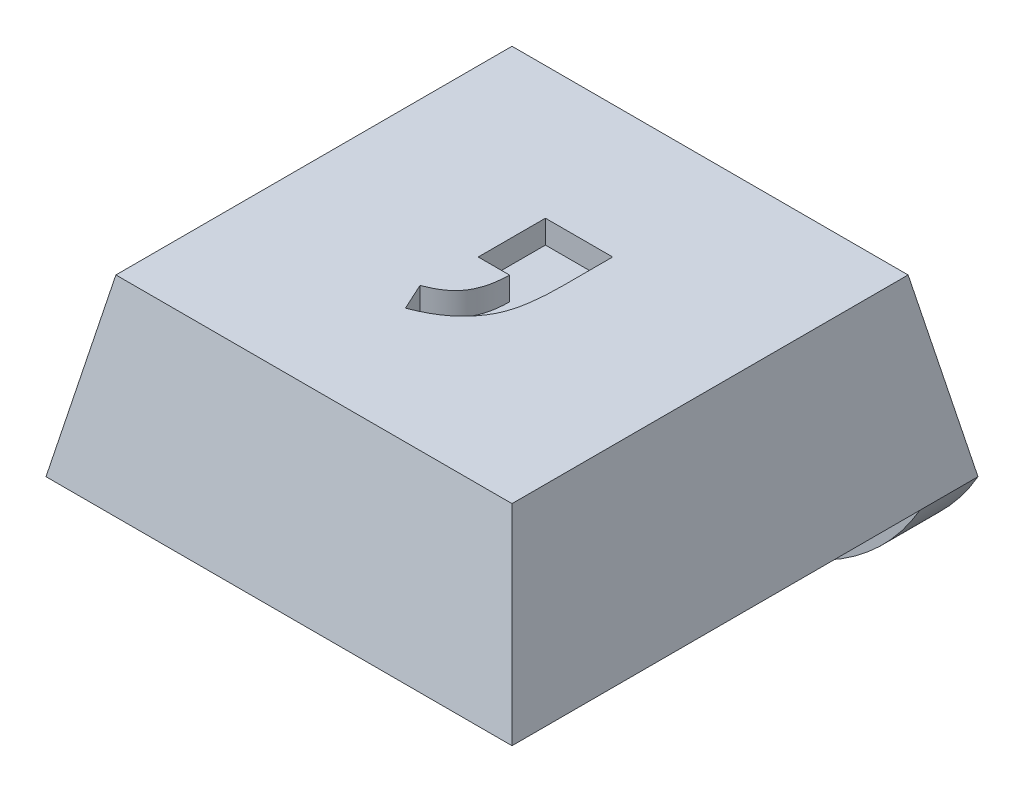
ISO-10303-21;
HEADER;
FILE_DESCRIPTION(('STEP AP214'),'2;1');
FILE_NAME('part.step','',(''),(''),'','','');
FILE_SCHEMA(('AUTOMOTIVE_DESIGN { 1 0 10303 214 1 1 1 1 }'));
ENDSEC;
DATA;
#1=APPLICATION_CONTEXT('core data for automotive mechanical design processes');
#2=APPLICATION_PROTOCOL_DEFINITION('international standard','automotive_design',2000,#1);
#3=PRODUCT_CONTEXT('',#1,'mechanical');
#4=PRODUCT('Part','Part','',(#3));
#5=PRODUCT_RELATED_PRODUCT_CATEGORY('part','',(#4));
#6=PRODUCT_DEFINITION_FORMATION('','',#4);
#7=PRODUCT_DEFINITION_CONTEXT('part definition',#1,'design');
#8=PRODUCT_DEFINITION('design','',#6,#7);
#9=PRODUCT_DEFINITION_SHAPE('','',#8);
#10=(LENGTH_UNIT() NAMED_UNIT(*) SI_UNIT(.MILLI.,.METRE.));
#11=(NAMED_UNIT(*) PLANE_ANGLE_UNIT() SI_UNIT($,.RADIAN.));
#12=(NAMED_UNIT(*) SI_UNIT($,.STERADIAN.) SOLID_ANGLE_UNIT());
#13=UNCERTAINTY_MEASURE_WITH_UNIT(LENGTH_MEASURE(1.E-05),#10,'distance_accuracy_value','');
#14=(GEOMETRIC_REPRESENTATION_CONTEXT(3) GLOBAL_UNCERTAINTY_ASSIGNED_CONTEXT((#13)) GLOBAL_UNIT_ASSIGNED_CONTEXT((#10,
#11,#12)) REPRESENTATION_CONTEXT('',''));
#15=CARTESIAN_POINT('',(0.,0.,0.));
#16=DIRECTION('',(0.,0.,1.));
#17=DIRECTION('',(1.,0.,0.));
#18=AXIS2_PLACEMENT_3D('',#15,#16,#17);
#19=CARTESIAN_POINT('',(0.,3.,0.));
#20=DIRECTION('',(0.,-1.,0.));
#21=DIRECTION('',(0.,0.,-1.));
#22=AXIS2_PLACEMENT_3D('',#19,#20,#21);
#23=PLANE('',#22);
#24=DIRECTION('',(-1.,0.,0.));
#25=VECTOR('',#24,1.);
#26=CARTESIAN_POINT('',(11.,3.,-0.6));
#27=LINE('',#26,#25);
#28=CARTESIAN_POINT('',(7.4,3.,-0.6));
#29=VERTEX_POINT('',#28);
#30=CARTESIAN_POINT('',(0.6,3.,-0.6));
#31=VERTEX_POINT('',#30);
#32=EDGE_CURVE('E200',#29,#31,#27,.T.);
#33=ORIENTED_EDGE('',*,*,#32,.F.);
#34=DIRECTION('',(0.,0.,1.));
#35=VECTOR('',#34,1.);
#36=CARTESIAN_POINT('',(7.4,3.,-8.));
#37=LINE('',#36,#35);
#38=CARTESIAN_POINT('',(7.4,3.,-7.4));
#39=VERTEX_POINT('',#38);
#40=EDGE_CURVE('E213',#39,#29,#37,.T.);
#41=ORIENTED_EDGE('',*,*,#40,.F.);
#42=DIRECTION('',(-1.,0.,0.));
#43=VECTOR('',#42,1.);
#44=CARTESIAN_POINT('',(11.,3.,-7.4));
#45=LINE('',#44,#43);
#46=CARTESIAN_POINT('',(0.599999999999999,3.,-7.4));
#47=VERTEX_POINT('',#46);
#48=EDGE_CURVE('E196',#39,#47,#45,.T.);
#49=ORIENTED_EDGE('',*,*,#48,.T.);
#50=DIRECTION('',(0.,0.,1.));
#51=VECTOR('',#50,1.);
#52=CARTESIAN_POINT('',(0.6,3.,-8.));
#53=LINE('',#52,#51);
#54=EDGE_CURVE('E216',#47,#31,#53,.T.);
#55=ORIENTED_EDGE('',*,*,#54,.T.);
#56=EDGE_LOOP('',(#33,#41,#49,#55));
#57=FACE_BOUND('',#56,.T.);
#58=DIRECTION('',(0.,0.,-1.));
#59=VECTOR('',#58,1.);
#60=CARTESIAN_POINT('',(3.44333189506148,3.,-3.97683988051996));
#61=LINE('',#60,#59);
#62=CARTESIAN_POINT('',(3.44333189506148,3.,-3.97683988051996));
#63=VERTEX_POINT('',#62);
#64=CARTESIAN_POINT('',(3.44333189506148,3.,-5.13068603436611));
#65=VERTEX_POINT('',#64);
#66=EDGE_CURVE('E59',#63,#65,#61,.T.);
#67=ORIENTED_EDGE('',*,*,#66,.T.);
#68=DIRECTION('',(1.,0.,0.));
#69=VECTOR('',#68,1.);
#70=CARTESIAN_POINT('',(3.44333189506148,3.,-5.13068603436611));
#71=LINE('',#70,#69);
#72=CARTESIAN_POINT('',(4.59717804890764,3.,-5.13068603436611));
#73=VERTEX_POINT('',#72);
#74=EDGE_CURVE('E168',#65,#73,#71,.T.);
#75=ORIENTED_EDGE('',*,*,#74,.T.);
#76=DIRECTION('',(0.,0.,1.));
#77=VECTOR('',#76,1.);
#78=CARTESIAN_POINT('',(4.59717804890764,3.,-5.13068603436611));
#79=LINE('',#78,#77);
#80=CARTESIAN_POINT('',(4.59717804890764,3.,-4.2917437266738));
#81=VERTEX_POINT('',#80);
#82=EDGE_CURVE('E569',#73,#81,#79,.T.);
#83=ORIENTED_EDGE('',*,*,#82,.T.);
#84=CARTESIAN_POINT('',(4.59717804890764,3.,-4.2917437266738));
#85=CARTESIAN_POINT('',(4.59664570205697,3.,-4.21117065502821));
#86=CARTESIAN_POINT('',(4.59564056136758,3.,-4.05903812587329));
#87=CARTESIAN_POINT('',(4.57802159676402,3.,-3.84443429493747));
#88=CARTESIAN_POINT('',(4.55354020663032,3.,-3.65597537157936));
#89=CARTESIAN_POINT('',(4.51459394977949,3.,-3.49123894257506));
#90=CARTESIAN_POINT('',(4.46244870361246,3.,-3.34246830222301));
#91=CARTESIAN_POINT('',(4.38872374214653,3.,-3.20633812547181));
#92=CARTESIAN_POINT('',(4.29805614703845,3.,-3.0760663071622));
#93=CARTESIAN_POINT('',(4.18715473139393,3.,-2.95559473776196));
#94=CARTESIAN_POINT('',(4.05957794146906,3.,-2.84417063430685));
#95=CARTESIAN_POINT('',(3.91384748090174,3.,-2.74727533534055));
#96=CARTESIAN_POINT('',(3.75342175566438,3.,-2.66094640759871));
#97=CARTESIAN_POINT('',(3.63816832671193,3.,-2.61549785110123));
#98=CARTESIAN_POINT('',(3.57914920275379,3.,-2.59222449590457));
#99=B_SPLINE_CURVE_WITH_KNOTS('',3,(#84,#85,#86,#87,#88,#89,#90,#91,#92,#93,#94,#95,#96,#97,
#98),.UNSPECIFIED.,.F.,.F.,(4,1,1,1,1,1,1,1,1,1,1,1,4),(0.,0.11226306929848,0.211967401940366,
0.29994169044828,0.376872974033872,0.447529216959618,0.518973247744178,0.591939579442453,
0.668229800220916,0.746606683184938,0.827453118097728,0.911641971053369,1.),.UNSPECIFIED.);
#100=CARTESIAN_POINT('',(3.57914920275379,3.,-2.59222449590457));
#101=VERTEX_POINT('',#100);
#102=EDGE_CURVE('E564',#81,#101,#99,.T.);
#103=ORIENTED_EDGE('',*,*,#102,.T.);
#104=DIRECTION('',(-0.418608195745654,0.,-0.908166933143114));
#105=VECTOR('',#104,1.);
#106=CARTESIAN_POINT('',(3.57914920275379,3.,-2.59222449590457));
#107=LINE('',#106,#105);
#108=CARTESIAN_POINT('',(3.36640881813841,3.,-3.05376295744303));
#109=VERTEX_POINT('',#108);
#110=EDGE_CURVE('E554',#101,#109,#107,.T.);
#111=ORIENTED_EDGE('',*,*,#110,.T.);
#112=CARTESIAN_POINT('',(3.36640881813841,3.,-3.05376295744303));
#113=CARTESIAN_POINT('',(3.41787487419886,3.,-3.0749283403816));
#114=CARTESIAN_POINT('',(3.51608049509068,3.,-3.11531533973616));
#115=CARTESIAN_POINT('',(3.64772184124044,3.,-3.19311523218575));
#116=CARTESIAN_POINT('',(3.75421652325334,3.,-3.28466671684255));
#117=CARTESIAN_POINT('',(3.83984154767036,3.,-3.38842301053576));
#118=CARTESIAN_POINT('',(3.9010592927936,3.,-3.51047208401217));
#119=CARTESIAN_POINT('',(3.94706557535518,3.,-3.64875286186587));
#120=CARTESIAN_POINT('',(3.97373457756071,3.,-3.80680253731697));
#121=CARTESIAN_POINT('',(3.97901655312841,3.,-3.91824926084624));
#122=CARTESIAN_POINT('',(3.98179343352302,3.,-3.97683988051996));
#123=B_SPLINE_CURVE_WITH_KNOTS('',3,(#112,#113,#114,#115,#116,#117,#118,#119,#120,#121,#122),
.UNSPECIFIED.,.F.,.F.,(4,1,1,1,1,1,1,1,4),(0.,0.139244977144443,0.26570210510156,
0.380936804013601,0.489358564032474,0.600190245832484,0.720743413981993,0.853187102279749,1.),.UNSPECIFIED.);
#124=CARTESIAN_POINT('',(3.98179343352302,3.,-3.97683988051996));
#125=VERTEX_POINT('',#124);
#126=EDGE_CURVE('E563',#109,#125,#123,.T.);
#127=ORIENTED_EDGE('',*,*,#126,.T.);
#128=DIRECTION('',(-1.,0.,0.));
#129=VECTOR('',#128,1.);
#130=CARTESIAN_POINT('',(3.98179343352302,3.,-3.97683988051996));
#131=LINE('',#130,#129);
#132=EDGE_CURVE('E164',#125,#63,#131,.T.);
#133=ORIENTED_EDGE('',*,*,#132,.T.);
#134=EDGE_LOOP('',(#67,#75,#83,#103,#111,#127,#133));
#135=FACE_BOUND('',#134,.T.);
#136=ADVANCED_FACE('F43',(#57,#135),#23,.F.);
#137=CARTESIAN_POINT('',(8.,0.,-8.));
#138=DIRECTION('',(-0.98058067569092,-0.196116135138184,0.));
#139=DIRECTION('',(0.196116135138184,-0.98058067569092,0.));
#140=AXIS2_PLACEMENT_3D('',#137,#138,#139);
#141=PLANE('',#140);
#142=DIRECTION('',(-0.192450089729875,0.962250448649376,-0.192450089729875));
#143=VECTOR('',#142,1.);
#144=CARTESIAN_POINT('',(7.7037037037037,1.48148148148148,-0.296296296296296));
#145=LINE('',#144,#143);
#146=CARTESIAN_POINT('',(8.,0.,0.));
#147=VERTEX_POINT('',#146);
#148=EDGE_CURVE('E210',#147,#29,#145,.T.);
#149=ORIENTED_EDGE('',*,*,#148,.F.);
#150=DIRECTION('',(0.,0.,-1.));
#151=VECTOR('',#150,1.);
#152=CARTESIAN_POINT('',(8.,0.,0.));
#153=LINE('',#152,#151);
#154=CARTESIAN_POINT('',(8.,0.,-7.));
#155=VERTEX_POINT('',#154);
#156=EDGE_CURVE('E229',#147,#155,#153,.T.);
#157=ORIENTED_EDGE('',*,*,#156,.T.);
#158=DIRECTION('',(0.,0.,1.));
#159=VECTOR('',#158,1.);
#160=CARTESIAN_POINT('',(8.,0.,-8.));
#161=LINE('',#160,#159);
#162=CARTESIAN_POINT('',(8.,0.,-8.));
#163=VERTEX_POINT('',#162);
#164=EDGE_CURVE('E170',#163,#155,#161,.T.);
#165=ORIENTED_EDGE('',*,*,#164,.F.);
#166=DIRECTION('',(0.192450089729875,-0.962250448649376,-0.192450089729875));
#167=VECTOR('',#166,1.);
#168=CARTESIAN_POINT('',(8.,0.,-8.));
#169=LINE('',#168,#167);
#170=EDGE_CURVE('E203',#39,#163,#169,.T.);
#171=ORIENTED_EDGE('',*,*,#170,.F.);
#172=ORIENTED_EDGE('',*,*,#40,.T.);
#173=EDGE_LOOP('',(#149,#157,#165,#171,#172));
#174=FACE_BOUND('',#173,.T.);
#175=ADVANCED_FACE('F297',(#174),#141,.F.);
#176=CARTESIAN_POINT('',(0.,0.,-8.));
#177=DIRECTION('',(0.98058067569092,-0.196116135138184,0.));
#178=DIRECTION('',(0.196116135138184,0.98058067569092,0.));
#179=AXIS2_PLACEMENT_3D('',#176,#177,#178);
#180=PLANE('',#179);
#181=DIRECTION('',(-0.192450089729875,-0.962250448649376,0.192450089729875));
#182=VECTOR('',#181,1.);
#183=CARTESIAN_POINT('',(0.296296296296296,1.48148148148148,-0.296296296296296));
#184=LINE('',#183,#182);
#185=CARTESIAN_POINT('',(0.,0.,0.));
#186=VERTEX_POINT('',#185);
#187=EDGE_CURVE('E257',#31,#186,#184,.T.);
#188=ORIENTED_EDGE('',*,*,#187,.F.);
#189=ORIENTED_EDGE('',*,*,#54,.F.);
#190=DIRECTION('',(0.192450089729875,0.962250448649376,0.192450089729875));
#191=VECTOR('',#190,1.);
#192=CARTESIAN_POINT('',(0.,0.,-8.));
#193=LINE('',#192,#191);
#194=CARTESIAN_POINT('',(0.,0.,-8.));
#195=VERTEX_POINT('',#194);
#196=EDGE_CURVE('E228',#195,#47,#193,.T.);
#197=ORIENTED_EDGE('',*,*,#196,.F.);
#198=DIRECTION('',(0.,0.,1.));
#199=VECTOR('',#198,1.);
#200=CARTESIAN_POINT('',(0.,0.,0.));
#201=LINE('',#200,#199);
#202=CARTESIAN_POINT('',(0.,0.,-7.));
#203=VERTEX_POINT('',#202);
#204=EDGE_CURVE('E233',#195,#203,#201,.T.);
#205=ORIENTED_EDGE('',*,*,#204,.T.);
#206=EDGE_CURVE('E220',#203,#186,#201,.T.);
#207=ORIENTED_EDGE('',*,*,#206,.T.);
#208=EDGE_LOOP('',(#188,#189,#197,#205,#207));
#209=FACE_BOUND('',#208,.T.);
#210=ADVANCED_FACE('F281',(#209),#180,.F.);
#211=CARTESIAN_POINT('',(0.,0.,0.));
#212=DIRECTION('',(0.,-1.,0.));
#213=DIRECTION('',(0.,0.,-1.));
#214=AXIS2_PLACEMENT_3D('',#211,#212,#213);
#215=PLANE('',#214);
#216=DIRECTION('',(-1.,0.,0.));
#217=VECTOR('',#216,1.);
#218=CARTESIAN_POINT('',(0.,0.,-7.));
#219=LINE('',#218,#217);
#220=EDGE_CURVE('E176',#155,#203,#219,.T.);
#221=ORIENTED_EDGE('',*,*,#220,.F.);
#222=ORIENTED_EDGE('',*,*,#156,.F.);
#223=DIRECTION('',(1.,0.,0.));
#224=VECTOR('',#223,1.);
#225=CARTESIAN_POINT('',(0.,0.,0.));
#226=LINE('',#225,#224);
#227=EDGE_CURVE('E230',#186,#147,#226,.T.);
#228=ORIENTED_EDGE('',*,*,#227,.F.);
#229=ORIENTED_EDGE('',*,*,#206,.F.);
#230=EDGE_LOOP('',(#221,#222,#228,#229));
#231=FACE_BOUND('',#230,.T.);
#232=CARTESIAN_POINT('',(4.,0.,-3.75));
#233=DIRECTION('',(0.,-1.,0.));
#234=DIRECTION('',(0.,0.,-1.));
#235=AXIS2_PLACEMENT_3D('',#232,#233,#234);
#236=CIRCLE('',#235,1.75);
#237=CARTESIAN_POINT('',(4.,0.,-5.5));
#238=VERTEX_POINT('',#237);
#239=EDGE_CURVE('E188',#238,#238,#236,.T.);
#240=ORIENTED_EDGE('',*,*,#239,.F.);
#241=EDGE_LOOP('',(#240));
#242=FACE_BOUND('',#241,.T.);
#243=ADVANCED_FACE('F292',(#231,#242),#215,.T.);
#244=CARTESIAN_POINT('',(11.,3.,-7.4));
#245=DIRECTION('',(0.,0.196116135138184,-0.98058067569092));
#246=DIRECTION('',(0.,0.98058067569092,0.196116135138184));
#247=AXIS2_PLACEMENT_3D('',#244,#245,#246);
#248=PLANE('',#247);
#249=ORIENTED_EDGE('',*,*,#170,.T.);
#250=DIRECTION('',(-1.,0.,0.));
#251=VECTOR('',#250,1.);
#252=CARTESIAN_POINT('',(0.,0.,-8.));
#253=LINE('',#252,#251);
#254=EDGE_CURVE('E224',#163,#195,#253,.T.);
#255=ORIENTED_EDGE('',*,*,#254,.T.);
#256=ORIENTED_EDGE('',*,*,#196,.T.);
#257=ORIENTED_EDGE('',*,*,#48,.F.);
#258=EDGE_LOOP('',(#249,#255,#256,#257));
#259=FACE_BOUND('',#258,.T.);
#260=ADVANCED_FACE('F276',(#259),#248,.T.);
#261=CARTESIAN_POINT('',(11.,0.,0.));
#262=DIRECTION('',(0.,0.196116135138184,0.98058067569092));
#263=DIRECTION('',(0.,-0.98058067569092,0.196116135138184));
#264=AXIS2_PLACEMENT_3D('',#261,#262,#263);
#265=PLANE('',#264);
#266=ORIENTED_EDGE('',*,*,#148,.T.);
#267=ORIENTED_EDGE('',*,*,#32,.T.);
#268=ORIENTED_EDGE('',*,*,#187,.T.);
#269=ORIENTED_EDGE('',*,*,#227,.T.);
#270=EDGE_LOOP('',(#266,#267,#268,#269));
#271=FACE_BOUND('',#270,.T.);
#272=ADVANCED_FACE('F321',(#271),#265,.T.);
#273=CARTESIAN_POINT('',(4.,0.4,-3.75));
#274=DIRECTION('',(0.,-1.,0.));
#275=DIRECTION('',(0.,0.,-1.));
#276=AXIS2_PLACEMENT_3D('',#273,#274,#275);
#277=CYLINDRICAL_SURFACE('',#276,1.75);
#278=CARTESIAN_POINT('',(4.,0.4,-3.75));
#279=DIRECTION('',(0.,-1.,0.));
#280=DIRECTION('',(0.,0.,-1.));
#281=AXIS2_PLACEMENT_3D('',#278,#279,#280);
#282=CIRCLE('',#281,1.75);
#283=CARTESIAN_POINT('',(4.,0.4,-5.5));
#284=VERTEX_POINT('',#283);
#285=EDGE_CURVE('E192',#284,#284,#282,.T.);
#286=ORIENTED_EDGE('',*,*,#285,.F.);
#287=EDGE_LOOP('',(#286));
#288=FACE_BOUND('',#287,.T.);
#289=ORIENTED_EDGE('',*,*,#239,.T.);
#290=EDGE_LOOP('',(#289));
#291=FACE_BOUND('',#290,.T.);
#292=ADVANCED_FACE('F328',(#288,#291),#277,.F.);
#293=CARTESIAN_POINT('',(4.,0.4,-3.75));
#294=DIRECTION('',(0.,-1.,0.));
#295=DIRECTION('',(0.,0.,-1.));
#296=AXIS2_PLACEMENT_3D('',#293,#294,#295);
#297=PLANE('',#296);
#298=ORIENTED_EDGE('',*,*,#285,.T.);
#299=EDGE_LOOP('',(#298));
#300=FACE_BOUND('',#299,.T.);
#301=ADVANCED_FACE('F332',(#300),#297,.T.);
#302=CARTESIAN_POINT('',(0.,-2.,-8.));
#303=DIRECTION('',(0.,0.,1.));
#304=DIRECTION('',(1.,0.,0.));
#305=AXIS2_PLACEMENT_3D('',#302,#303,#304);
#306=PLANE('',#305);
#307=ORIENTED_EDGE('',*,*,#254,.F.);
#308=CARTESIAN_POINT('',(4.53589838486225,2.,-8.));
#309=DIRECTION('',(0.,0.,1.));
#310=DIRECTION('',(1.,0.,0.));
#311=AXIS2_PLACEMENT_3D('',#308,#309,#310);
#312=CIRCLE('',#311,4.);
#313=CARTESIAN_POINT('',(4.53589838486225,-2.,-8.));
#314=VERTEX_POINT('',#313);
#315=EDGE_CURVE('E11',#163,#314,#312,.F.);
#316=ORIENTED_EDGE('',*,*,#315,.T.);
#317=DIRECTION('',(1.,0.,0.));
#318=VECTOR('',#317,1.);
#319=CARTESIAN_POINT('',(0.,-2.,-8.));
#320=LINE('',#319,#318);
#321=CARTESIAN_POINT('',(3.46410161513775,-2.,-8.));
#322=VERTEX_POINT('',#321);
#323=EDGE_CURVE('E182',#322,#314,#320,.T.);
#324=ORIENTED_EDGE('',*,*,#323,.F.);
#325=CARTESIAN_POINT('',(3.46410161513775,2.,-8.));
#326=DIRECTION('',(0.,0.,1.));
#327=DIRECTION('',(1.,0.,0.));
#328=AXIS2_PLACEMENT_3D('',#325,#326,#327);
#329=CIRCLE('',#328,4.);
#330=EDGE_CURVE('E52',#322,#195,#329,.F.);
#331=ORIENTED_EDGE('',*,*,#330,.T.);
#332=EDGE_LOOP('',(#307,#316,#324,#331));
#333=FACE_BOUND('',#332,.T.);
#334=ADVANCED_FACE('F269',(#333),#306,.F.);
#335=CARTESIAN_POINT('',(0.,-2.,-7.));
#336=DIRECTION('',(0.,0.,-1.));
#337=DIRECTION('',(-1.,0.,0.));
#338=AXIS2_PLACEMENT_3D('',#335,#336,#337);
#339=PLANE('',#338);
#340=DIRECTION('',(-1.,0.,0.));
#341=VECTOR('',#340,1.);
#342=CARTESIAN_POINT('',(0.,-2.,-7.));
#343=LINE('',#342,#341);
#344=CARTESIAN_POINT('',(4.53589838486225,-2.,-7.));
#345=VERTEX_POINT('',#344);
#346=CARTESIAN_POINT('',(3.46410161513775,-2.,-7.));
#347=VERTEX_POINT('',#346);
#348=EDGE_CURVE('E186',#345,#347,#343,.T.);
#349=ORIENTED_EDGE('',*,*,#348,.F.);
#350=CARTESIAN_POINT('',(4.53589838486225,2.,-7.));
#351=DIRECTION('',(0.,0.,-1.));
#352=DIRECTION('',(-1.,0.,0.));
#353=AXIS2_PLACEMENT_3D('',#350,#351,#352);
#354=CIRCLE('',#353,4.);
#355=EDGE_CURVE('E263',#345,#155,#354,.F.);
#356=ORIENTED_EDGE('',*,*,#355,.T.);
#357=ORIENTED_EDGE('',*,*,#220,.T.);
#358=CARTESIAN_POINT('',(3.46410161513775,2.,-7.));
#359=DIRECTION('',(0.,0.,-1.));
#360=DIRECTION('',(-1.,0.,0.));
#361=AXIS2_PLACEMENT_3D('',#358,#359,#360);
#362=CIRCLE('',#361,4.);
#363=EDGE_CURVE('E67',#203,#347,#362,.F.);
#364=ORIENTED_EDGE('',*,*,#363,.T.);
#365=EDGE_LOOP('',(#349,#356,#357,#364));
#366=FACE_BOUND('',#365,.T.);
#367=ADVANCED_FACE('F287',(#366),#339,.F.);
#368=CARTESIAN_POINT('',(0.,-2.,0.));
#369=DIRECTION('',(0.,1.,0.));
#370=DIRECTION('',(0.,0.,1.));
#371=AXIS2_PLACEMENT_3D('',#368,#369,#370);
#372=PLANE('',#371);
#373=ORIENTED_EDGE('',*,*,#323,.T.);
#374=DIRECTION('',(0.,0.,1.));
#375=VECTOR('',#374,1.);
#376=CARTESIAN_POINT('',(4.53589838486225,-2.,0.));
#377=LINE('',#376,#375);
#378=EDGE_CURVE('E256',#314,#345,#377,.T.);
#379=ORIENTED_EDGE('',*,*,#378,.T.);
#380=ORIENTED_EDGE('',*,*,#348,.T.);
#381=DIRECTION('',(0.,0.,-1.));
#382=VECTOR('',#381,1.);
#383=CARTESIAN_POINT('',(3.46410161513775,-2.,0.));
#384=LINE('',#383,#382);
#385=EDGE_CURVE('E252',#347,#322,#384,.T.);
#386=ORIENTED_EDGE('',*,*,#385,.T.);
#387=EDGE_LOOP('',(#373,#379,#380,#386));
#388=FACE_BOUND('',#387,.T.);
#389=ADVANCED_FACE('F285',(#388),#372,.F.);
#390=CARTESIAN_POINT('',(4.53589838486225,2.,-8.));
#391=DIRECTION('',(0.,0.,1.));
#392=DIRECTION('',(1.,0.,0.));
#393=AXIS2_PLACEMENT_3D('',#390,#391,#392);
#394=CYLINDRICAL_SURFACE('',#393,4.);
#395=ORIENTED_EDGE('',*,*,#315,.F.);
#396=ORIENTED_EDGE('',*,*,#164,.T.);
#397=ORIENTED_EDGE('',*,*,#355,.F.);
#398=ORIENTED_EDGE('',*,*,#378,.F.);
#399=EDGE_LOOP('',(#395,#396,#397,#398));
#400=FACE_BOUND('',#399,.T.);
#401=ADVANCED_FACE('F298',(#400),#394,.T.);
#402=CARTESIAN_POINT('',(3.46410161513775,2.,-8.));
#403=DIRECTION('',(0.,0.,-1.));
#404=DIRECTION('',(-1.,0.,0.));
#405=AXIS2_PLACEMENT_3D('',#402,#403,#404);
#406=CYLINDRICAL_SURFACE('',#405,4.);
#407=ORIENTED_EDGE('',*,*,#363,.F.);
#408=ORIENTED_EDGE('',*,*,#204,.F.);
#409=ORIENTED_EDGE('',*,*,#330,.F.);
#410=ORIENTED_EDGE('',*,*,#385,.F.);
#411=EDGE_LOOP('',(#407,#408,#409,#410));
#412=FACE_BOUND('',#411,.T.);
#413=ADVANCED_FACE('F45',(#412),#406,.T.);
#414=CARTESIAN_POINT('',(3.44333189506148,2.6,-3.97683988051996));
#415=DIRECTION('',(1.,0.,0.));
#416=DIRECTION('',(0.,0.,-1.));
#417=AXIS2_PLACEMENT_3D('',#414,#415,#416);
#418=PLANE('',#417);
#419=ORIENTED_EDGE('',*,*,#66,.F.);
#420=DIRECTION('',(0.,1.,0.));
#421=VECTOR('',#420,1.);
#422=CARTESIAN_POINT('',(3.44333189506148,2.6,-3.97683988051996));
#423=LINE('',#422,#421);
#424=CARTESIAN_POINT('',(3.44333189506148,2.6,-3.97683988051996));
#425=VERTEX_POINT('',#424);
#426=EDGE_CURVE('E162',#425,#63,#423,.T.);
#427=ORIENTED_EDGE('',*,*,#426,.F.);
#428=DIRECTION('',(0.,0.,-1.));
#429=VECTOR('',#428,1.);
#430=CARTESIAN_POINT('',(3.44333189506148,2.6,-3.97683988051996));
#431=LINE('',#430,#429);
#432=CARTESIAN_POINT('',(3.44333189506148,2.6,-5.13068603436611));
#433=VERTEX_POINT('',#432);
#434=EDGE_CURVE('E152',#425,#433,#431,.T.);
#435=ORIENTED_EDGE('',*,*,#434,.T.);
#436=DIRECTION('',(0.,1.,0.));
#437=VECTOR('',#436,1.);
#438=CARTESIAN_POINT('',(3.44333189506148,2.6,-5.13068603436611));
#439=LINE('',#438,#437);
#440=EDGE_CURVE('E161',#433,#65,#439,.T.);
#441=ORIENTED_EDGE('',*,*,#440,.T.);
#442=EDGE_LOOP('',(#419,#427,#435,#441));
#443=FACE_BOUND('',#442,.T.);
#444=ADVANCED_FACE('F160',(#443),#418,.T.);
#445=CARTESIAN_POINT('',(3.44333189506148,2.6,-5.13068603436611));
#446=DIRECTION('',(0.,0.,1.));
#447=DIRECTION('',(1.,0.,0.));
#448=AXIS2_PLACEMENT_3D('',#445,#446,#447);
#449=PLANE('',#448);
#450=ORIENTED_EDGE('',*,*,#74,.F.);
#451=ORIENTED_EDGE('',*,*,#440,.F.);
#452=DIRECTION('',(1.,0.,0.));
#453=VECTOR('',#452,1.);
#454=CARTESIAN_POINT('',(3.44333189506148,2.6,-5.13068603436611));
#455=LINE('',#454,#453);
#456=CARTESIAN_POINT('',(4.59717804890764,2.6,-5.13068603436611));
#457=VERTEX_POINT('',#456);
#458=EDGE_CURVE('E148',#433,#457,#455,.T.);
#459=ORIENTED_EDGE('',*,*,#458,.T.);
#460=DIRECTION('',(0.,1.,0.));
#461=VECTOR('',#460,1.);
#462=CARTESIAN_POINT('',(4.59717804890764,2.6,-5.13068603436611));
#463=LINE('',#462,#461);
#464=EDGE_CURVE('E171',#457,#73,#463,.T.);
#465=ORIENTED_EDGE('',*,*,#464,.T.);
#466=EDGE_LOOP('',(#450,#451,#459,#465));
#467=FACE_BOUND('',#466,.T.);
#468=ADVANCED_FACE('F166',(#467),#449,.T.);
#469=CARTESIAN_POINT('',(4.59717804890764,2.6,-5.13068603436611));
#470=DIRECTION('',(-1.,0.,0.));
#471=DIRECTION('',(0.,0.,1.));
#472=AXIS2_PLACEMENT_3D('',#469,#470,#471);
#473=PLANE('',#472);
#474=ORIENTED_EDGE('',*,*,#82,.F.);
#475=ORIENTED_EDGE('',*,*,#464,.F.);
#476=DIRECTION('',(0.,0.,1.));
#477=VECTOR('',#476,1.);
#478=CARTESIAN_POINT('',(4.59717804890764,2.6,-5.13068603436611));
#479=LINE('',#478,#477);
#480=CARTESIAN_POINT('',(4.59717804890764,2.6,-4.2917437266738));
#481=VERTEX_POINT('',#480);
#482=EDGE_CURVE('E154',#457,#481,#479,.T.);
#483=ORIENTED_EDGE('',*,*,#482,.T.);
#484=DIRECTION('',(0.,1.,0.));
#485=VECTOR('',#484,1.);
#486=CARTESIAN_POINT('',(4.59717804890764,2.6,-4.2917437266738));
#487=LINE('',#486,#485);
#488=EDGE_CURVE('E178',#481,#81,#487,.T.);
#489=ORIENTED_EDGE('',*,*,#488,.T.);
#490=EDGE_LOOP('',(#474,#475,#483,#489));
#491=FACE_BOUND('',#490,.T.);
#492=ADVANCED_FACE('F345',(#491),#473,.T.);
#493=CARTESIAN_POINT('',(4.59717804890764,2.6,-4.2917437266738));
#494=CARTESIAN_POINT('',(4.59664570205697,2.6,-4.21117065502821));
#495=CARTESIAN_POINT('',(4.59564056136758,2.6,-4.05903812587329));
#496=CARTESIAN_POINT('',(4.57802159676402,2.6,-3.84443429493747));
#497=CARTESIAN_POINT('',(4.55354020663032,2.6,-3.65597537157936));
#498=CARTESIAN_POINT('',(4.51459394977949,2.6,-3.49123894257506));
#499=CARTESIAN_POINT('',(4.46244870361246,2.6,-3.34246830222301));
#500=CARTESIAN_POINT('',(4.38872374214653,2.6,-3.20633812547181));
#501=CARTESIAN_POINT('',(4.29805614703845,2.6,-3.0760663071622));
#502=CARTESIAN_POINT('',(4.18715473139393,2.6,-2.95559473776196));
#503=CARTESIAN_POINT('',(4.05957794146906,2.6,-2.84417063430685));
#504=CARTESIAN_POINT('',(3.91384748090174,2.6,-2.74727533534055));
#505=CARTESIAN_POINT('',(3.75342175566438,2.6,-2.66094640759871));
#506=CARTESIAN_POINT('',(3.63816832671193,2.6,-2.61549785110123));
#507=CARTESIAN_POINT('',(3.57914920275379,2.6,-2.59222449590457));
#508=B_SPLINE_CURVE_WITH_KNOTS('',3,(#493,#494,#495,#496,#497,#498,#499,#500,#501,#502,#503,
#504,#505,#506,#507),.UNSPECIFIED.,.F.,.F.,(4,1,1,1,1,1,1,1,1,1,1,1,4),(0.,0.11226306929848,
0.211967401940366,0.29994169044828,0.376872974033872,0.447529216959618,0.518973247744178,
0.591939579442453,0.668229800220916,0.746606683184938,0.827453118097728,0.911641971053369,1.),.UNSPECIFIED.);
#509=DIRECTION('',(0.,1.,0.));
#510=VECTOR('',#509,1.);
#511=SURFACE_OF_LINEAR_EXTRUSION('',#508,#510);
#512=ORIENTED_EDGE('',*,*,#102,.F.);
#513=ORIENTED_EDGE('',*,*,#488,.F.);
#514=CARTESIAN_POINT('',(3.57914920275379,2.6,-2.59222449590457));
#515=VERTEX_POINT('',#514);
#516=EDGE_CURVE('E356',#481,#515,#508,.T.);
#517=ORIENTED_EDGE('',*,*,#516,.T.);
#518=DIRECTION('',(0.,1.,0.));
#519=VECTOR('',#518,1.);
#520=CARTESIAN_POINT('',(3.57914920275379,2.6,-2.59222449590457));
#521=LINE('',#520,#519);
#522=EDGE_CURVE('E556',#515,#101,#521,.T.);
#523=ORIENTED_EDGE('',*,*,#522,.T.);
#524=EDGE_LOOP('',(#512,#513,#517,#523));
#525=FACE_BOUND('',#524,.T.);
#526=ADVANCED_FACE('F348',(#525),#511,.T.);
#527=CARTESIAN_POINT('',(3.57914920275379,2.6,-2.59222449590457));
#528=DIRECTION('',(0.908166933143113,0.,-0.418608195745654));
#529=DIRECTION('',(-0.418608195745654,0.,-0.908166933143114));
#530=AXIS2_PLACEMENT_3D('',#527,#528,#529);
#531=PLANE('',#530);
#532=ORIENTED_EDGE('',*,*,#110,.F.);
#533=ORIENTED_EDGE('',*,*,#522,.F.);
#534=DIRECTION('',(-0.418608195745654,0.,-0.908166933143114));
#535=VECTOR('',#534,1.);
#536=CARTESIAN_POINT('',(3.57914920275379,2.6,-2.59222449590457));
#537=LINE('',#536,#535);
#538=CARTESIAN_POINT('',(3.36640881813841,2.6,-3.05376295744303));
#539=VERTEX_POINT('',#538);
#540=EDGE_CURVE('E363',#515,#539,#537,.T.);
#541=ORIENTED_EDGE('',*,*,#540,.T.);
#542=DIRECTION('',(0.,1.,0.));
#543=VECTOR('',#542,1.);
#544=CARTESIAN_POINT('',(3.36640881813841,2.6,-3.05376295744303));
#545=LINE('',#544,#543);
#546=EDGE_CURVE('E559',#539,#109,#545,.T.);
#547=ORIENTED_EDGE('',*,*,#546,.T.);
#548=EDGE_LOOP('',(#532,#533,#541,#547));
#549=FACE_BOUND('',#548,.T.);
#550=ADVANCED_FACE('F353',(#549),#531,.T.);
#551=CARTESIAN_POINT('',(3.36640881813841,2.6,-3.05376295744303));
#552=CARTESIAN_POINT('',(3.41787487419886,2.6,-3.0749283403816));
#553=CARTESIAN_POINT('',(3.51608049509068,2.6,-3.11531533973616));
#554=CARTESIAN_POINT('',(3.64772184124044,2.6,-3.19311523218575));
#555=CARTESIAN_POINT('',(3.75421652325334,2.6,-3.28466671684255));
#556=CARTESIAN_POINT('',(3.83984154767036,2.6,-3.38842301053576));
#557=CARTESIAN_POINT('',(3.9010592927936,2.6,-3.51047208401217));
#558=CARTESIAN_POINT('',(3.94706557535518,2.6,-3.64875286186587));
#559=CARTESIAN_POINT('',(3.97373457756071,2.6,-3.80680253731697));
#560=CARTESIAN_POINT('',(3.97901655312841,2.6,-3.91824926084624));
#561=CARTESIAN_POINT('',(3.98179343352302,2.6,-3.97683988051996));
#562=B_SPLINE_CURVE_WITH_KNOTS('',3,(#551,#552,#553,#554,#555,#556,#557,#558,#559,#560,#561),
.UNSPECIFIED.,.F.,.F.,(4,1,1,1,1,1,1,1,4),(0.,0.139244977144443,0.26570210510156,
0.380936804013601,0.489358564032474,0.600190245832484,0.720743413981993,0.853187102279749,1.),.UNSPECIFIED.);
#563=DIRECTION('',(0.,1.,0.));
#564=VECTOR('',#563,1.);
#565=SURFACE_OF_LINEAR_EXTRUSION('',#562,#564);
#566=ORIENTED_EDGE('',*,*,#126,.F.);
#567=ORIENTED_EDGE('',*,*,#546,.F.);
#568=CARTESIAN_POINT('',(3.98179343352302,2.6,-3.97683988051996));
#569=VERTEX_POINT('',#568);
#570=EDGE_CURVE('E369',#539,#569,#562,.T.);
#571=ORIENTED_EDGE('',*,*,#570,.T.);
#572=DIRECTION('',(0.,1.,0.));
#573=VECTOR('',#572,1.);
#574=CARTESIAN_POINT('',(3.98179343352302,2.6,-3.97683988051996));
#575=LINE('',#574,#573);
#576=EDGE_CURVE('E594',#569,#125,#575,.T.);
#577=ORIENTED_EDGE('',*,*,#576,.T.);
#578=EDGE_LOOP('',(#566,#567,#571,#577));
#579=FACE_BOUND('',#578,.T.);
#580=ADVANCED_FACE('F380',(#579),#565,.T.);
#581=CARTESIAN_POINT('',(3.98179343352302,2.6,-3.97683988051996));
#582=DIRECTION('',(0.,0.,-1.));
#583=DIRECTION('',(-1.,0.,0.));
#584=AXIS2_PLACEMENT_3D('',#581,#582,#583);
#585=PLANE('',#584);
#586=ORIENTED_EDGE('',*,*,#132,.F.);
#587=ORIENTED_EDGE('',*,*,#576,.F.);
#588=DIRECTION('',(-1.,0.,0.));
#589=VECTOR('',#588,1.);
#590=CARTESIAN_POINT('',(3.98179343352302,2.6,-3.97683988051996));
#591=LINE('',#590,#589);
#592=EDGE_CURVE('E375',#569,#425,#591,.T.);
#593=ORIENTED_EDGE('',*,*,#592,.T.);
#594=ORIENTED_EDGE('',*,*,#426,.T.);
#595=EDGE_LOOP('',(#586,#587,#593,#594));
#596=FACE_BOUND('',#595,.T.);
#597=ADVANCED_FACE('F383',(#596),#585,.T.);
#598=CARTESIAN_POINT('',(4.40773488743229,2.6,-3.24395907771287));
#599=DIRECTION('',(2.28914748493507E-13,1.,0.));
#600=DIRECTION('',(-1.,2.28914748493507E-13,0.));
#601=AXIS2_PLACEMENT_3D('',#598,#599,#600);
#602=PLANE('',#601);
#603=ORIENTED_EDGE('',*,*,#434,.F.);
#604=ORIENTED_EDGE('',*,*,#592,.F.);
#605=ORIENTED_EDGE('',*,*,#570,.F.);
#606=ORIENTED_EDGE('',*,*,#540,.F.);
#607=ORIENTED_EDGE('',*,*,#516,.F.);
#608=ORIENTED_EDGE('',*,*,#482,.F.);
#609=ORIENTED_EDGE('',*,*,#458,.F.);
#610=EDGE_LOOP('',(#603,#604,#605,#606,#607,#608,#609));
#611=FACE_BOUND('',#610,.T.);
#612=ADVANCED_FACE('F150',(#611),#602,.T.);
#613=CLOSED_SHELL('',(#136,#175,#210,#243,#260,#272,#292,#301,#334,#367,#389,#401,#413,#444,
#468,#492,#526,#550,#580,#597,#612));
#614=MANIFOLD_SOLID_BREP('B2',#613);
#615=ADVANCED_BREP_SHAPE_REPRESENTATION('',(#18,#614),#14);
#616=SHAPE_DEFINITION_REPRESENTATION(#9,#615);
ENDSEC;
END-ISO-10303-21;
